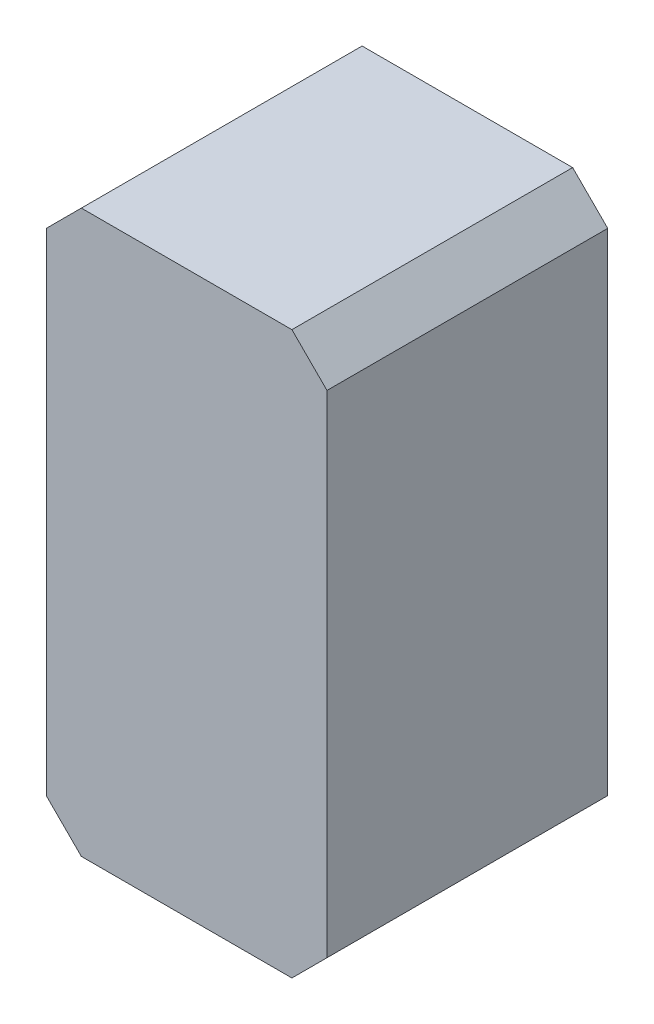
ISO-10303-21;
HEADER;
FILE_DESCRIPTION(('STEP AP214'),'2;1');
FILE_NAME('part.step','',(''),(''),'','','');
FILE_SCHEMA(('AUTOMOTIVE_DESIGN { 1 0 10303 214 1 1 1 1 }'));
ENDSEC;
DATA;
#1=APPLICATION_CONTEXT('core data for automotive mechanical design processes');
#2=APPLICATION_PROTOCOL_DEFINITION('international standard','automotive_design',2000,#1);
#3=PRODUCT_CONTEXT('',#1,'mechanical');
#4=PRODUCT('Part','Part','',(#3));
#5=PRODUCT_RELATED_PRODUCT_CATEGORY('part','',(#4));
#6=PRODUCT_DEFINITION_FORMATION('','',#4);
#7=PRODUCT_DEFINITION_CONTEXT('part definition',#1,'design');
#8=PRODUCT_DEFINITION('design','',#6,#7);
#9=PRODUCT_DEFINITION_SHAPE('','',#8);
#10=(LENGTH_UNIT() NAMED_UNIT(*) SI_UNIT(.MILLI.,.METRE.));
#11=(NAMED_UNIT(*) PLANE_ANGLE_UNIT() SI_UNIT($,.RADIAN.));
#12=(NAMED_UNIT(*) SI_UNIT($,.STERADIAN.) SOLID_ANGLE_UNIT());
#13=UNCERTAINTY_MEASURE_WITH_UNIT(LENGTH_MEASURE(1.E-05),#10,'distance_accuracy_value','');
#14=(GEOMETRIC_REPRESENTATION_CONTEXT(3) GLOBAL_UNCERTAINTY_ASSIGNED_CONTEXT((#13)) GLOBAL_UNIT_ASSIGNED_CONTEXT((#10,
#11,#12)) REPRESENTATION_CONTEXT('',''));
#15=CARTESIAN_POINT('',(0.,0.,0.));
#16=DIRECTION('',(0.,0.,1.));
#17=DIRECTION('',(1.,0.,0.));
#18=AXIS2_PLACEMENT_3D('',#15,#16,#17);
#19=CARTESIAN_POINT('',(2.,4.,4.));
#20=DIRECTION('',(-1.,0.,0.));
#21=DIRECTION('',(0.,-1.,0.));
#22=AXIS2_PLACEMENT_3D('',#19,#20,#21);
#23=PLANE('',#22);
#24=DIRECTION('',(0.,1.,0.));
#25=VECTOR('',#24,1.);
#26=CARTESIAN_POINT('',(2.,4.,4.));
#27=LINE('',#26,#25);
#28=CARTESIAN_POINT('',(2.,-3.5,4.));
#29=VERTEX_POINT('',#28);
#30=CARTESIAN_POINT('',(2.,3.5,4.));
#31=VERTEX_POINT('',#30);
#32=EDGE_CURVE('E127',#29,#31,#27,.T.);
#33=ORIENTED_EDGE('',*,*,#32,.F.);
#34=DIRECTION('',(0.,0.,-1.));
#35=VECTOR('',#34,1.);
#36=CARTESIAN_POINT('',(2.,-3.5,4.));
#37=LINE('',#36,#35);
#38=CARTESIAN_POINT('',(2.,-3.5,0.));
#39=VERTEX_POINT('',#38);
#40=EDGE_CURVE('E153',#29,#39,#37,.T.);
#41=ORIENTED_EDGE('',*,*,#40,.T.);
#42=DIRECTION('',(0.,1.,0.));
#43=VECTOR('',#42,1.);
#44=CARTESIAN_POINT('',(2.,4.,0.));
#45=LINE('',#44,#43);
#46=CARTESIAN_POINT('',(2.,3.5,0.));
#47=VERTEX_POINT('',#46);
#48=EDGE_CURVE('E161',#39,#47,#45,.T.);
#49=ORIENTED_EDGE('',*,*,#48,.T.);
#50=DIRECTION('',(0.,0.,1.));
#51=VECTOR('',#50,1.);
#52=CARTESIAN_POINT('',(2.,3.5,4.));
#53=LINE('',#52,#51);
#54=EDGE_CURVE('E151',#47,#31,#53,.T.);
#55=ORIENTED_EDGE('',*,*,#54,.T.);
#56=EDGE_LOOP('',(#33,#41,#49,#55));
#57=FACE_BOUND('',#56,.T.);
#58=ADVANCED_FACE('F35',(#57),#23,.F.);
#59=CARTESIAN_POINT('',(-2.,4.,4.));
#60=DIRECTION('',(0.,-1.,0.));
#61=DIRECTION('',(0.,0.,-1.));
#62=AXIS2_PLACEMENT_3D('',#59,#60,#61);
#63=PLANE('',#62);
#64=DIRECTION('',(-1.,0.,0.));
#65=VECTOR('',#64,1.);
#66=CARTESIAN_POINT('',(-2.,4.,0.));
#67=LINE('',#66,#65);
#68=CARTESIAN_POINT('',(1.5,4.,0.));
#69=VERTEX_POINT('',#68);
#70=CARTESIAN_POINT('',(-1.5,4.,0.));
#71=VERTEX_POINT('',#70);
#72=EDGE_CURVE('E132',#69,#71,#67,.T.);
#73=ORIENTED_EDGE('',*,*,#72,.T.);
#74=DIRECTION('',(0.,0.,1.));
#75=VECTOR('',#74,1.);
#76=CARTESIAN_POINT('',(-1.5,4.,4.));
#77=LINE('',#76,#75);
#78=CARTESIAN_POINT('',(-1.5,4.,4.));
#79=VERTEX_POINT('',#78);
#80=EDGE_CURVE('E11',#71,#79,#77,.T.);
#81=ORIENTED_EDGE('',*,*,#80,.T.);
#82=DIRECTION('',(-1.,0.,0.));
#83=VECTOR('',#82,1.);
#84=CARTESIAN_POINT('',(-2.,4.,4.));
#85=LINE('',#84,#83);
#86=CARTESIAN_POINT('',(1.5,4.,4.));
#87=VERTEX_POINT('',#86);
#88=EDGE_CURVE('E130',#87,#79,#85,.T.);
#89=ORIENTED_EDGE('',*,*,#88,.F.);
#90=DIRECTION('',(0.,0.,-1.));
#91=VECTOR('',#90,1.);
#92=CARTESIAN_POINT('',(1.5,4.,4.));
#93=LINE('',#92,#91);
#94=EDGE_CURVE('E44',#87,#69,#93,.T.);
#95=ORIENTED_EDGE('',*,*,#94,.T.);
#96=EDGE_LOOP('',(#73,#81,#89,#95));
#97=FACE_BOUND('',#96,.T.);
#98=ADVANCED_FACE('F158',(#97),#63,.F.);
#99=CARTESIAN_POINT('',(-2.,4.,4.));
#100=DIRECTION('',(1.,0.,0.));
#101=DIRECTION('',(0.,1.,0.));
#102=AXIS2_PLACEMENT_3D('',#99,#100,#101);
#103=PLANE('',#102);
#104=DIRECTION('',(0.,-1.,0.));
#105=VECTOR('',#104,1.);
#106=CARTESIAN_POINT('',(-2.,4.,0.));
#107=LINE('',#106,#105);
#108=CARTESIAN_POINT('',(-2.,3.5,0.));
#109=VERTEX_POINT('',#108);
#110=CARTESIAN_POINT('',(-2.,-3.5,0.));
#111=VERTEX_POINT('',#110);
#112=EDGE_CURVE('E128',#109,#111,#107,.T.);
#113=ORIENTED_EDGE('',*,*,#112,.T.);
#114=DIRECTION('',(0.,0.,1.));
#115=VECTOR('',#114,1.);
#116=CARTESIAN_POINT('',(-2.,-3.5,4.));
#117=LINE('',#116,#115);
#118=CARTESIAN_POINT('',(-2.,-3.5,4.));
#119=VERTEX_POINT('',#118);
#120=EDGE_CURVE('E106',#111,#119,#117,.T.);
#121=ORIENTED_EDGE('',*,*,#120,.T.);
#122=DIRECTION('',(0.,-1.,0.));
#123=VECTOR('',#122,1.);
#124=CARTESIAN_POINT('',(-2.,4.,4.));
#125=LINE('',#124,#123);
#126=CARTESIAN_POINT('',(-2.,3.5,4.));
#127=VERTEX_POINT('',#126);
#128=EDGE_CURVE('E165',#127,#119,#125,.T.);
#129=ORIENTED_EDGE('',*,*,#128,.F.);
#130=DIRECTION('',(0.,0.,-1.));
#131=VECTOR('',#130,1.);
#132=CARTESIAN_POINT('',(-2.,3.5,4.));
#133=LINE('',#132,#131);
#134=EDGE_CURVE('E111',#127,#109,#133,.T.);
#135=ORIENTED_EDGE('',*,*,#134,.T.);
#136=EDGE_LOOP('',(#113,#121,#129,#135));
#137=FACE_BOUND('',#136,.T.);
#138=ADVANCED_FACE('F175',(#137),#103,.F.);
#139=CARTESIAN_POINT('',(-2.,-4.,4.));
#140=DIRECTION('',(0.,1.,0.));
#141=DIRECTION('',(0.,0.,1.));
#142=AXIS2_PLACEMENT_3D('',#139,#140,#141);
#143=PLANE('',#142);
#144=DIRECTION('',(1.,0.,0.));
#145=VECTOR('',#144,1.);
#146=CARTESIAN_POINT('',(-2.,-4.,4.));
#147=LINE('',#146,#145);
#148=CARTESIAN_POINT('',(-1.5,-4.,4.));
#149=VERTEX_POINT('',#148);
#150=CARTESIAN_POINT('',(1.5,-4.,4.));
#151=VERTEX_POINT('',#150);
#152=EDGE_CURVE('E121',#149,#151,#147,.T.);
#153=ORIENTED_EDGE('',*,*,#152,.F.);
#154=DIRECTION('',(0.,0.,-1.));
#155=VECTOR('',#154,1.);
#156=CARTESIAN_POINT('',(-1.5,-4.,4.));
#157=LINE('',#156,#155);
#158=CARTESIAN_POINT('',(-1.5,-4.,0.));
#159=VERTEX_POINT('',#158);
#160=EDGE_CURVE('E105',#149,#159,#157,.T.);
#161=ORIENTED_EDGE('',*,*,#160,.T.);
#162=DIRECTION('',(1.,0.,0.));
#163=VECTOR('',#162,1.);
#164=CARTESIAN_POINT('',(-2.,-4.,0.));
#165=LINE('',#164,#163);
#166=CARTESIAN_POINT('',(1.5,-4.,0.));
#167=VERTEX_POINT('',#166);
#168=EDGE_CURVE('E118',#159,#167,#165,.T.);
#169=ORIENTED_EDGE('',*,*,#168,.T.);
#170=DIRECTION('',(0.,0.,1.));
#171=VECTOR('',#170,1.);
#172=CARTESIAN_POINT('',(1.5,-4.,4.));
#173=LINE('',#172,#171);
#174=EDGE_CURVE('E123',#167,#151,#173,.T.);
#175=ORIENTED_EDGE('',*,*,#174,.T.);
#176=EDGE_LOOP('',(#153,#161,#169,#175));
#177=FACE_BOUND('',#176,.T.);
#178=ADVANCED_FACE('F117',(#177),#143,.F.);
#179=CARTESIAN_POINT('',(0.,0.,4.));
#180=DIRECTION('',(0.,0.,1.));
#181=DIRECTION('',(1.,0.,0.));
#182=AXIS2_PLACEMENT_3D('',#179,#180,#181);
#183=PLANE('',#182);
#184=ORIENTED_EDGE('',*,*,#128,.T.);
#185=DIRECTION('',(-0.707106781186548,0.707106781186547,0.));
#186=VECTOR('',#185,1.);
#187=CARTESIAN_POINT('',(-2.75,-2.75,4.));
#188=LINE('',#187,#186);
#189=EDGE_CURVE('E149',#119,#149,#188,.F.);
#190=ORIENTED_EDGE('',*,*,#189,.T.);
#191=ORIENTED_EDGE('',*,*,#152,.T.);
#192=DIRECTION('',(-0.707106781186548,-0.707106781186548,0.));
#193=VECTOR('',#192,1.);
#194=CARTESIAN_POINT('',(2.75,-2.75,4.));
#195=LINE('',#194,#193);
#196=EDGE_CURVE('E147',#151,#29,#195,.F.);
#197=ORIENTED_EDGE('',*,*,#196,.T.);
#198=ORIENTED_EDGE('',*,*,#32,.T.);
#199=DIRECTION('',(0.707106781186548,-0.707106781186547,0.));
#200=VECTOR('',#199,1.);
#201=CARTESIAN_POINT('',(2.75,2.75,4.));
#202=LINE('',#201,#200);
#203=EDGE_CURVE('E56',#31,#87,#202,.F.);
#204=ORIENTED_EDGE('',*,*,#203,.T.);
#205=ORIENTED_EDGE('',*,*,#88,.T.);
#206=DIRECTION('',(0.707106781186548,0.707106781186548,0.));
#207=VECTOR('',#206,1.);
#208=CARTESIAN_POINT('',(-2.75,2.75,4.));
#209=LINE('',#208,#207);
#210=EDGE_CURVE('E145',#79,#127,#209,.F.);
#211=ORIENTED_EDGE('',*,*,#210,.T.);
#212=EDGE_LOOP('',(#184,#190,#191,#197,#198,#204,#205,#211));
#213=FACE_BOUND('',#212,.T.);
#214=ADVANCED_FACE('F169',(#213),#183,.T.);
#215=CARTESIAN_POINT('',(0.,0.,0.));
#216=DIRECTION('',(0.,0.,1.));
#217=DIRECTION('',(1.,0.,0.));
#218=AXIS2_PLACEMENT_3D('',#215,#216,#217);
#219=PLANE('',#218);
#220=ORIENTED_EDGE('',*,*,#168,.F.);
#221=DIRECTION('',(0.707106781186548,-0.707106781186547,0.));
#222=VECTOR('',#221,1.);
#223=CARTESIAN_POINT('',(-1.5,-4.,0.));
#224=LINE('',#223,#222);
#225=EDGE_CURVE('E101',#159,#111,#224,.F.);
#226=ORIENTED_EDGE('',*,*,#225,.T.);
#227=ORIENTED_EDGE('',*,*,#112,.F.);
#228=DIRECTION('',(-0.707106781186548,-0.707106781186548,0.));
#229=VECTOR('',#228,1.);
#230=CARTESIAN_POINT('',(-2.,3.5,0.));
#231=LINE('',#230,#229);
#232=EDGE_CURVE('E138',#109,#71,#231,.F.);
#233=ORIENTED_EDGE('',*,*,#232,.T.);
#234=ORIENTED_EDGE('',*,*,#72,.F.);
#235=DIRECTION('',(-0.707106781186548,0.707106781186547,0.));
#236=VECTOR('',#235,1.);
#237=CARTESIAN_POINT('',(1.5,4.,0.));
#238=LINE('',#237,#236);
#239=EDGE_CURVE('E122',#69,#47,#238,.F.);
#240=ORIENTED_EDGE('',*,*,#239,.T.);
#241=ORIENTED_EDGE('',*,*,#48,.F.);
#242=DIRECTION('',(0.707106781186548,0.707106781186548,0.));
#243=VECTOR('',#242,1.);
#244=CARTESIAN_POINT('',(2.,-3.5,0.));
#245=LINE('',#244,#243);
#246=EDGE_CURVE('E112',#39,#167,#245,.F.);
#247=ORIENTED_EDGE('',*,*,#246,.T.);
#248=EDGE_LOOP('',(#220,#226,#227,#233,#234,#240,#241,#247));
#249=FACE_BOUND('',#248,.T.);
#250=ADVANCED_FACE('F125',(#249),#219,.F.);
#251=CARTESIAN_POINT('',(-1.5,-4.,4.));
#252=DIRECTION('',(0.707106781186547,0.707106781186548,0.));
#253=DIRECTION('',(0.,0.,-1.));
#254=AXIS2_PLACEMENT_3D('',#251,#252,#253);
#255=PLANE('',#254);
#256=ORIENTED_EDGE('',*,*,#189,.F.);
#257=ORIENTED_EDGE('',*,*,#120,.F.);
#258=ORIENTED_EDGE('',*,*,#225,.F.);
#259=ORIENTED_EDGE('',*,*,#160,.F.);
#260=EDGE_LOOP('',(#256,#257,#258,#259));
#261=FACE_BOUND('',#260,.T.);
#262=ADVANCED_FACE('F104',(#261),#255,.F.);
#263=CARTESIAN_POINT('',(2.,-3.5,4.));
#264=DIRECTION('',(-0.707106781186548,0.707106781186548,0.));
#265=DIRECTION('',(0.,0.,-1.));
#266=AXIS2_PLACEMENT_3D('',#263,#264,#265);
#267=PLANE('',#266);
#268=ORIENTED_EDGE('',*,*,#196,.F.);
#269=ORIENTED_EDGE('',*,*,#174,.F.);
#270=ORIENTED_EDGE('',*,*,#246,.F.);
#271=ORIENTED_EDGE('',*,*,#40,.F.);
#272=EDGE_LOOP('',(#268,#269,#270,#271));
#273=FACE_BOUND('',#272,.T.);
#274=ADVANCED_FACE('F180',(#273),#267,.F.);
#275=CARTESIAN_POINT('',(-2.,3.5,4.));
#276=DIRECTION('',(0.707106781186548,-0.707106781186548,0.));
#277=DIRECTION('',(0.,0.,-1.));
#278=AXIS2_PLACEMENT_3D('',#275,#276,#277);
#279=PLANE('',#278);
#280=ORIENTED_EDGE('',*,*,#210,.F.);
#281=ORIENTED_EDGE('',*,*,#80,.F.);
#282=ORIENTED_EDGE('',*,*,#232,.F.);
#283=ORIENTED_EDGE('',*,*,#134,.F.);
#284=EDGE_LOOP('',(#280,#281,#282,#283));
#285=FACE_BOUND('',#284,.T.);
#286=ADVANCED_FACE('F173',(#285),#279,.F.);
#287=CARTESIAN_POINT('',(1.5,4.,4.));
#288=DIRECTION('',(-0.707106781186547,-0.707106781186548,0.));
#289=DIRECTION('',(0.,0.,-1.));
#290=AXIS2_PLACEMENT_3D('',#287,#288,#289);
#291=PLANE('',#290);
#292=ORIENTED_EDGE('',*,*,#203,.F.);
#293=ORIENTED_EDGE('',*,*,#54,.F.);
#294=ORIENTED_EDGE('',*,*,#239,.F.);
#295=ORIENTED_EDGE('',*,*,#94,.F.);
#296=EDGE_LOOP('',(#292,#293,#294,#295));
#297=FACE_BOUND('',#296,.T.);
#298=ADVANCED_FACE('F38',(#297),#291,.F.);
#299=CLOSED_SHELL('',(#58,#98,#138,#178,#214,#250,#262,#274,#286,#298));
#300=MANIFOLD_SOLID_BREP('B2',#299);
#301=ADVANCED_BREP_SHAPE_REPRESENTATION('',(#18,#300),#14);
#302=SHAPE_DEFINITION_REPRESENTATION(#9,#301);
ENDSEC;
END-ISO-10303-21;
